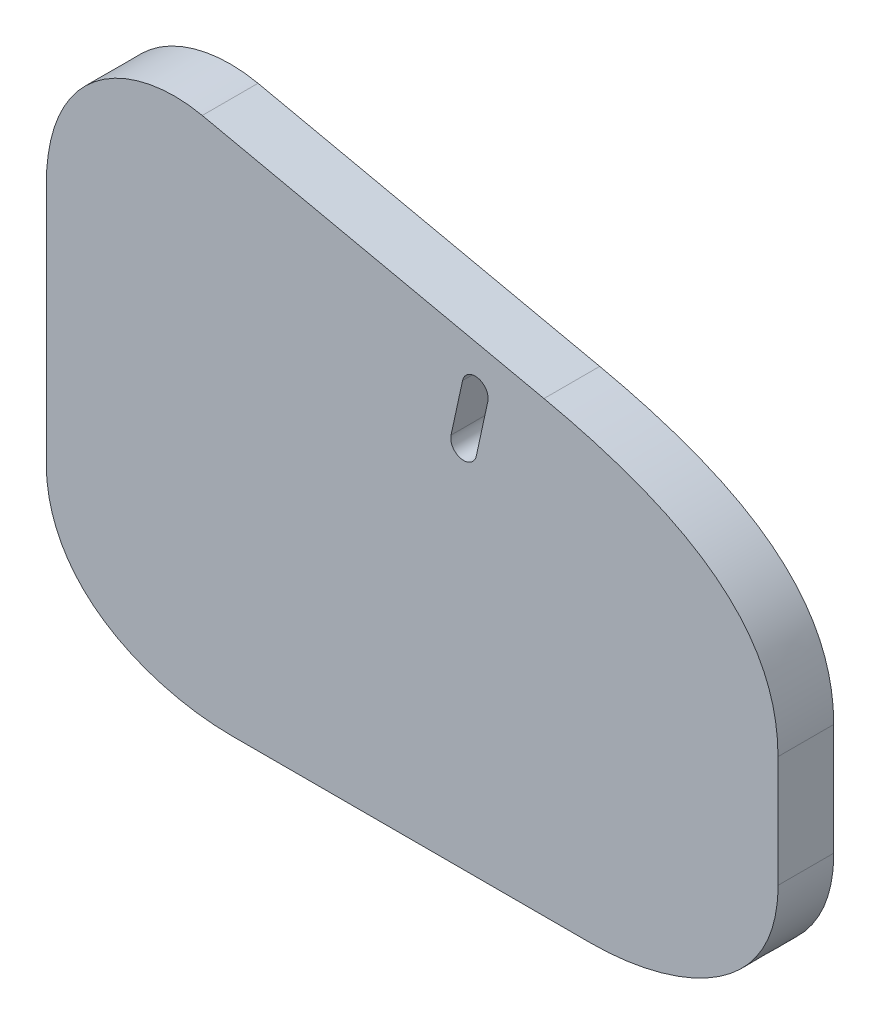
ISO-10303-21;
HEADER;
FILE_DESCRIPTION(('STEP AP214'),'2;1');
FILE_NAME('part.step','',(''),(''),'','','');
FILE_SCHEMA(('AUTOMOTIVE_DESIGN { 1 0 10303 214 1 1 1 1 }'));
ENDSEC;
DATA;
#1=APPLICATION_CONTEXT('core data for automotive mechanical design processes');
#2=APPLICATION_PROTOCOL_DEFINITION('international standard','automotive_design',2000,#1);
#3=PRODUCT_CONTEXT('',#1,'mechanical');
#4=PRODUCT('Part','Part','',(#3));
#5=PRODUCT_RELATED_PRODUCT_CATEGORY('part','',(#4));
#6=PRODUCT_DEFINITION_FORMATION('','',#4);
#7=PRODUCT_DEFINITION_CONTEXT('part definition',#1,'design');
#8=PRODUCT_DEFINITION('design','',#6,#7);
#9=PRODUCT_DEFINITION_SHAPE('','',#8);
#10=(LENGTH_UNIT() NAMED_UNIT(*) SI_UNIT(.MILLI.,.METRE.));
#11=(NAMED_UNIT(*) PLANE_ANGLE_UNIT() SI_UNIT($,.RADIAN.));
#12=(NAMED_UNIT(*) SI_UNIT($,.STERADIAN.) SOLID_ANGLE_UNIT());
#13=UNCERTAINTY_MEASURE_WITH_UNIT(LENGTH_MEASURE(1.E-05),#10,'distance_accuracy_value','');
#14=(GEOMETRIC_REPRESENTATION_CONTEXT(3) GLOBAL_UNCERTAINTY_ASSIGNED_CONTEXT((#13)) GLOBAL_UNIT_ASSIGNED_CONTEXT((#10,
#11,#12)) REPRESENTATION_CONTEXT('',''));
#15=CARTESIAN_POINT('',(0.,0.,0.));
#16=DIRECTION('',(0.,0.,1.));
#17=DIRECTION('',(1.,0.,0.));
#18=AXIS2_PLACEMENT_3D('',#15,#16,#17);
#19=CARTESIAN_POINT('',(-56.3993302443461,40.1399079020647,10.));
#20=DIRECTION('',(0.,0.,-1.));
#21=DIRECTION('',(-1.,0.,0.));
#22=AXIS2_PLACEMENT_3D('',#19,#20,#21);
#23=CYLINDRICAL_SURFACE('',#22,2.31868075153577);
#24=CARTESIAN_POINT('',(-56.3993302443461,40.1399079020647,0.));
#25=DIRECTION('',(0.,0.,1.));
#26=DIRECTION('',(1.,0.,0.));
#27=AXIS2_PLACEMENT_3D('',#24,#25,#26);
#28=CIRCLE('',#27,2.31868075153577);
#29=CARTESIAN_POINT('',(-58.6650902702296,40.6324644294307,0.));
#30=VERTEX_POINT('',#29);
#31=CARTESIAN_POINT('',(-54.1335702184626,39.6473513746988,0.));
#32=VERTEX_POINT('',#31);
#33=EDGE_CURVE('E196',#30,#32,#28,.T.);
#34=ORIENTED_EDGE('',*,*,#33,.F.);
#35=DIRECTION('',(0.,0.,-1.));
#36=VECTOR('',#35,1.);
#37=CARTESIAN_POINT('',(-58.6650902702296,40.6324644294307,10.));
#38=LINE('',#37,#36);
#39=CARTESIAN_POINT('',(-58.6650902702296,40.6324644294307,10.));
#40=VERTEX_POINT('',#39);
#41=EDGE_CURVE('E11',#40,#30,#38,.T.);
#42=ORIENTED_EDGE('',*,*,#41,.F.);
#43=CARTESIAN_POINT('',(-56.3993302443461,40.1399079020647,10.));
#44=DIRECTION('',(0.,0.,1.));
#45=DIRECTION('',(1.,0.,0.));
#46=AXIS2_PLACEMENT_3D('',#43,#44,#45);
#47=CIRCLE('',#46,2.31868075153577);
#48=CARTESIAN_POINT('',(-54.1335702184626,39.6473513746988,10.));
#49=VERTEX_POINT('',#48);
#50=EDGE_CURVE('E149',#40,#49,#47,.T.);
#51=ORIENTED_EDGE('',*,*,#50,.T.);
#52=DIRECTION('',(0.,0.,-1.));
#53=VECTOR('',#52,1.);
#54=CARTESIAN_POINT('',(-54.1335702184626,39.6473513746988,10.));
#55=LINE('',#54,#53);
#56=EDGE_CURVE('E102',#49,#32,#55,.T.);
#57=ORIENTED_EDGE('',*,*,#56,.T.);
#58=EDGE_LOOP('',(#34,#42,#51,#57));
#59=FACE_BOUND('',#58,.T.);
#60=ADVANCED_FACE('F36',(#59),#23,.F.);
#61=CARTESIAN_POINT('',(-64.4522854915812,14.0113664112133,10.));
#62=DIRECTION('',(0.977176363922801,-0.212429644331043,0.));
#63=DIRECTION('',(0.212429644331043,0.977176363922801,0.));
#64=AXIS2_PLACEMENT_3D('',#61,#62,#63);
#65=PLANE('',#64);
#66=DIRECTION('',(-0.212429644331043,-0.977176363922801,0.));
#67=VECTOR('',#66,1.);
#68=CARTESIAN_POINT('',(-64.4522854915812,14.0113664112133,0.));
#69=LINE('',#68,#67);
#70=CARTESIAN_POINT('',(-56.5985730675187,50.138443561901,0.));
#71=VERTEX_POINT('',#70);
#72=EDGE_CURVE('E141',#71,#30,#69,.T.);
#73=ORIENTED_EDGE('',*,*,#72,.F.);
#74=DIRECTION('',(0.,0.,-1.));
#75=VECTOR('',#74,1.);
#76=CARTESIAN_POINT('',(-56.5985730675187,50.138443561901,10.));
#77=LINE('',#76,#75);
#78=CARTESIAN_POINT('',(-56.5985730675187,50.138443561901,10.));
#79=VERTEX_POINT('',#78);
#80=EDGE_CURVE('E47',#79,#71,#77,.T.);
#81=ORIENTED_EDGE('',*,*,#80,.F.);
#82=DIRECTION('',(-0.212429644331043,-0.977176363922801,0.));
#83=VECTOR('',#82,1.);
#84=CARTESIAN_POINT('',(-64.4522854915812,14.0113664112133,10.));
#85=LINE('',#84,#83);
#86=EDGE_CURVE('E139',#79,#40,#85,.T.);
#87=ORIENTED_EDGE('',*,*,#86,.T.);
#88=ORIENTED_EDGE('',*,*,#41,.T.);
#89=EDGE_LOOP('',(#73,#81,#87,#88));
#90=FACE_BOUND('',#89,.T.);
#91=ADVANCED_FACE('F138',(#90),#65,.T.);
#92=CARTESIAN_POINT('',(-54.3328130416352,49.645887034535,10.));
#93=DIRECTION('',(0.,0.,-1.));
#94=DIRECTION('',(-1.,0.,0.));
#95=AXIS2_PLACEMENT_3D('',#92,#93,#94);
#96=CYLINDRICAL_SURFACE('',#95,2.31868075153577);
#97=CARTESIAN_POINT('',(-54.3328130416352,49.645887034535,0.));
#98=DIRECTION('',(0.,0.,1.));
#99=DIRECTION('',(1.,0.,0.));
#100=AXIS2_PLACEMENT_3D('',#97,#98,#99);
#101=CIRCLE('',#100,2.31868075153577);
#102=CARTESIAN_POINT('',(-52.0670530157517,49.153330507169,0.));
#103=VERTEX_POINT('',#102);
#104=EDGE_CURVE('E200',#103,#71,#101,.T.);
#105=ORIENTED_EDGE('',*,*,#104,.F.);
#106=DIRECTION('',(0.,0.,-1.));
#107=VECTOR('',#106,1.);
#108=CARTESIAN_POINT('',(-52.0670530157517,49.153330507169,10.));
#109=LINE('',#108,#107);
#110=CARTESIAN_POINT('',(-52.0670530157517,49.153330507169,10.));
#111=VERTEX_POINT('',#110);
#112=EDGE_CURVE('E95',#111,#103,#109,.T.);
#113=ORIENTED_EDGE('',*,*,#112,.F.);
#114=CARTESIAN_POINT('',(-54.3328130416352,49.645887034535,10.));
#115=DIRECTION('',(0.,0.,1.));
#116=DIRECTION('',(1.,0.,0.));
#117=AXIS2_PLACEMENT_3D('',#114,#115,#116);
#118=CIRCLE('',#117,2.31868075153577);
#119=EDGE_CURVE('E148',#111,#79,#118,.T.);
#120=ORIENTED_EDGE('',*,*,#119,.T.);
#121=ORIENTED_EDGE('',*,*,#80,.T.);
#122=EDGE_LOOP('',(#105,#113,#120,#121));
#123=FACE_BOUND('',#122,.T.);
#124=ADVANCED_FACE('F151',(#123),#96,.F.);
#125=CARTESIAN_POINT('',(-97.9695492341357,-25.7697680525164,10.));
#126=CARTESIAN_POINT('',(-112.011160689261,-25.7697680525164,10.));
#127=CARTESIAN_POINT('',(-131.292525164114,-19.0251558180361,10.));
#128=CARTESIAN_POINT('',(-131.292525164114,0.,10.));
#129=B_SPLINE_CURVE_WITH_KNOTS('',3,(#125,#126,#127,#128),.UNSPECIFIED.,.F.,.F.,(4,4),(0.,1.),.UNSPECIFIED.);
#130=DIRECTION('',(0.,0.,-1.));
#131=VECTOR('',#130,1.);
#132=SURFACE_OF_LINEAR_EXTRUSION('',#129,#131);
#133=CARTESIAN_POINT('',(-97.9695492341357,-25.7697680525164,0.));
#134=CARTESIAN_POINT('',(-112.011160689261,-25.7697680525164,0.));
#135=CARTESIAN_POINT('',(-131.292525164114,-19.0251558180361,0.));
#136=CARTESIAN_POINT('',(-131.292525164114,0.,0.));
#137=B_SPLINE_CURVE_WITH_KNOTS('',3,(#133,#134,#135,#136),.UNSPECIFIED.,.F.,.F.,(4,4),(0.,1.),.UNSPECIFIED.);
#138=CARTESIAN_POINT('',(-97.9695492341357,-25.7697680525164,0.));
#139=VERTEX_POINT('',#138);
#140=CARTESIAN_POINT('',(-131.292525164114,0.,0.));
#141=VERTEX_POINT('',#140);
#142=EDGE_CURVE('E157',#139,#141,#137,.T.);
#143=ORIENTED_EDGE('',*,*,#142,.F.);
#144=DIRECTION('',(0.,0.,-1.));
#145=VECTOR('',#144,1.);
#146=CARTESIAN_POINT('',(-97.9695492341357,-25.7697680525164,10.));
#147=LINE('',#146,#145);
#148=CARTESIAN_POINT('',(-97.9695492341357,-25.7697680525164,10.));
#149=VERTEX_POINT('',#148);
#150=EDGE_CURVE('E41',#149,#139,#147,.T.);
#151=ORIENTED_EDGE('',*,*,#150,.F.);
#152=CARTESIAN_POINT('',(-131.292525164114,0.,10.));
#153=VERTEX_POINT('',#152);
#154=EDGE_CURVE('E204',#149,#153,#129,.T.);
#155=ORIENTED_EDGE('',*,*,#154,.T.);
#156=DIRECTION('',(0.,0.,-1.));
#157=VECTOR('',#156,1.);
#158=CARTESIAN_POINT('',(-131.292525164114,0.,10.));
#159=LINE('',#158,#157);
#160=EDGE_CURVE('E153',#153,#141,#159,.T.);
#161=ORIENTED_EDGE('',*,*,#160,.T.);
#162=EDGE_LOOP('',(#143,#151,#155,#161));
#163=FACE_BOUND('',#162,.T.);
#164=ADVANCED_FACE('F38',(#163),#132,.T.);
#165=CARTESIAN_POINT('',(0.,-25.7697680525164,10.));
#166=DIRECTION('',(0.,-1.,0.));
#167=DIRECTION('',(0.,0.,-1.));
#168=AXIS2_PLACEMENT_3D('',#165,#166,#167);
#169=PLANE('',#168);
#170=DIRECTION('',(-1.,0.,0.));
#171=VECTOR('',#170,1.);
#172=CARTESIAN_POINT('',(0.,-25.7697680525164,0.));
#173=LINE('',#172,#171);
#174=CARTESIAN_POINT('',(-33.5451291028447,-25.7697680525164,0.));
#175=VERTEX_POINT('',#174);
#176=EDGE_CURVE('E162',#175,#139,#173,.T.);
#177=ORIENTED_EDGE('',*,*,#176,.F.);
#178=DIRECTION('',(0.,0.,-1.));
#179=VECTOR('',#178,1.);
#180=CARTESIAN_POINT('',(-33.5451291028447,-25.7697680525164,10.));
#181=LINE('',#180,#179);
#182=CARTESIAN_POINT('',(-33.5451291028447,-25.7697680525164,10.));
#183=VERTEX_POINT('',#182);
#184=EDGE_CURVE('E222',#183,#175,#181,.T.);
#185=ORIENTED_EDGE('',*,*,#184,.F.);
#186=DIRECTION('',(-1.,0.,0.));
#187=VECTOR('',#186,1.);
#188=CARTESIAN_POINT('',(0.,-25.7697680525164,10.));
#189=LINE('',#188,#187);
#190=EDGE_CURVE('E231',#183,#149,#189,.T.);
#191=ORIENTED_EDGE('',*,*,#190,.T.);
#192=ORIENTED_EDGE('',*,*,#150,.T.);
#193=EDGE_LOOP('',(#177,#185,#191,#192));
#194=FACE_BOUND('',#193,.T.);
#195=ADVANCED_FACE('F229',(#194),#169,.T.);
#196=CARTESIAN_POINT('',(-33.5451291028447,-25.7697680525164,10.));
#197=CARTESIAN_POINT('',(-19.4448665678301,-25.7697680525164,10.));
#198=CARTESIAN_POINT('',(0.,-19.0637574545764,10.));
#199=CARTESIAN_POINT('',(0.,0.,10.));
#200=B_SPLINE_CURVE_WITH_KNOTS('',3,(#196,#197,#198,#199),.UNSPECIFIED.,.F.,.F.,(4,4),(0.,1.),.UNSPECIFIED.);
#201=DIRECTION('',(0.,0.,-1.));
#202=VECTOR('',#201,1.);
#203=SURFACE_OF_LINEAR_EXTRUSION('',#200,#202);
#204=CARTESIAN_POINT('',(-33.5451291028447,-25.7697680525164,0.));
#205=CARTESIAN_POINT('',(-19.4448665678301,-25.7697680525164,0.));
#206=CARTESIAN_POINT('',(0.,-19.0637574545764,0.));
#207=CARTESIAN_POINT('',(0.,0.,0.));
#208=B_SPLINE_CURVE_WITH_KNOTS('',3,(#204,#205,#206,#207),.UNSPECIFIED.,.F.,.F.,(4,4),(0.,1.),.UNSPECIFIED.);
#209=CARTESIAN_POINT('',(0.,0.,0.));
#210=VERTEX_POINT('',#209);
#211=EDGE_CURVE('E168',#175,#210,#208,.T.);
#212=ORIENTED_EDGE('',*,*,#211,.T.);
#213=DIRECTION('',(0.,0.,-1.));
#214=VECTOR('',#213,1.);
#215=CARTESIAN_POINT('',(0.,0.,10.));
#216=LINE('',#215,#214);
#217=CARTESIAN_POINT('',(0.,0.,10.));
#218=VERTEX_POINT('',#217);
#219=EDGE_CURVE('E220',#218,#210,#216,.T.);
#220=ORIENTED_EDGE('',*,*,#219,.F.);
#221=EDGE_CURVE('E249',#183,#218,#200,.T.);
#222=ORIENTED_EDGE('',*,*,#221,.F.);
#223=ORIENTED_EDGE('',*,*,#184,.T.);
#224=EDGE_LOOP('',(#212,#220,#222,#223));
#225=FACE_BOUND('',#224,.T.);
#226=ADVANCED_FACE('F240',(#225),#203,.F.);
#227=CARTESIAN_POINT('',(0.,0.,10.));
#228=DIRECTION('',(-1.,0.,0.));
#229=DIRECTION('',(0.,0.,1.));
#230=AXIS2_PLACEMENT_3D('',#227,#228,#229);
#231=PLANE('',#230);
#232=DIRECTION('',(0.,1.,0.));
#233=VECTOR('',#232,1.);
#234=CARTESIAN_POINT('',(0.,0.,0.));
#235=LINE('',#234,#233);
#236=CARTESIAN_POINT('',(0.,20.,0.));
#237=VERTEX_POINT('',#236);
#238=EDGE_CURVE('E172',#210,#237,#235,.T.);
#239=ORIENTED_EDGE('',*,*,#238,.T.);
#240=DIRECTION('',(0.,0.,-1.));
#241=VECTOR('',#240,1.);
#242=CARTESIAN_POINT('',(0.,20.,10.));
#243=LINE('',#242,#241);
#244=CARTESIAN_POINT('',(0.,20.,10.));
#245=VERTEX_POINT('',#244);
#246=EDGE_CURVE('E217',#245,#237,#243,.T.);
#247=ORIENTED_EDGE('',*,*,#246,.F.);
#248=DIRECTION('',(0.,1.,0.));
#249=VECTOR('',#248,1.);
#250=CARTESIAN_POINT('',(0.,0.,10.));
#251=LINE('',#250,#249);
#252=EDGE_CURVE('E245',#218,#245,#251,.T.);
#253=ORIENTED_EDGE('',*,*,#252,.F.);
#254=ORIENTED_EDGE('',*,*,#219,.T.);
#255=EDGE_LOOP('',(#239,#247,#253,#254));
#256=FACE_BOUND('',#255,.T.);
#257=ADVANCED_FACE('F243',(#256),#231,.F.);
#258=CARTESIAN_POINT('',(0.,20.,10.));
#259=CARTESIAN_POINT('',(0.,38.1460258986672,10.));
#260=CARTESIAN_POINT('',(-14.2094741821754,48.6110988969908,10.));
#261=CARTESIAN_POINT('',(-41.9869496717725,54.6496805251641,10.));
#262=B_SPLINE_CURVE_WITH_KNOTS('',3,(#258,#259,#260,#261),.UNSPECIFIED.,.F.,.F.,(4,4),(0.,1.),.UNSPECIFIED.);
#263=DIRECTION('',(0.,0.,-1.));
#264=VECTOR('',#263,1.);
#265=SURFACE_OF_LINEAR_EXTRUSION('',#262,#264);
#266=CARTESIAN_POINT('',(0.,20.,0.));
#267=CARTESIAN_POINT('',(0.,38.1460258986672,0.));
#268=CARTESIAN_POINT('',(-14.2094741821754,48.6110988969908,0.));
#269=CARTESIAN_POINT('',(-41.9869496717725,54.6496805251641,0.));
#270=B_SPLINE_CURVE_WITH_KNOTS('',3,(#266,#267,#268,#269),.UNSPECIFIED.,.F.,.F.,(4,4),(0.,1.),.UNSPECIFIED.);
#271=CARTESIAN_POINT('',(-41.9869496717725,54.6496805251641,0.));
#272=VERTEX_POINT('',#271);
#273=EDGE_CURVE('E177',#237,#272,#270,.T.);
#274=ORIENTED_EDGE('',*,*,#273,.T.);
#275=DIRECTION('',(0.,0.,-1.));
#276=VECTOR('',#275,1.);
#277=CARTESIAN_POINT('',(-41.9869496717725,54.6496805251641,10.));
#278=LINE('',#277,#276);
#279=CARTESIAN_POINT('',(-41.9869496717725,54.6496805251641,10.));
#280=VERTEX_POINT('',#279);
#281=EDGE_CURVE('E214',#280,#272,#278,.T.);
#282=ORIENTED_EDGE('',*,*,#281,.F.);
#283=EDGE_CURVE('E248',#245,#280,#262,.T.);
#284=ORIENTED_EDGE('',*,*,#283,.F.);
#285=ORIENTED_EDGE('',*,*,#246,.T.);
#286=EDGE_LOOP('',(#274,#282,#284,#285));
#287=FACE_BOUND('',#286,.T.);
#288=ADVANCED_FACE('F267',(#287),#265,.F.);
#289=CARTESIAN_POINT('',(9.44952981696672,43.4678371580469,10.));
#290=DIRECTION('',(-0.212429644331044,-0.977176363922801,0.));
#291=DIRECTION('',(0.977176363922801,-0.212429644331044,0.));
#292=AXIS2_PLACEMENT_3D('',#289,#290,#291);
#293=PLANE('',#292);
#294=DIRECTION('',(-0.977176363922801,0.212429644331044,0.));
#295=VECTOR('',#294,1.);
#296=CARTESIAN_POINT('',(9.44952981696672,43.4678371580469,0.));
#297=LINE('',#296,#295);
#298=CARTESIAN_POINT('',(-103.301225382932,67.9788708971554,0.));
#299=VERTEX_POINT('',#298);
#300=EDGE_CURVE('E181',#272,#299,#297,.T.);
#301=ORIENTED_EDGE('',*,*,#300,.T.);
#302=DIRECTION('',(0.,0.,-1.));
#303=VECTOR('',#302,1.);
#304=CARTESIAN_POINT('',(-103.301225382932,67.9788708971554,10.));
#305=LINE('',#304,#303);
#306=CARTESIAN_POINT('',(-103.301225382932,67.9788708971554,10.));
#307=VERTEX_POINT('',#306);
#308=EDGE_CURVE('E211',#307,#299,#305,.T.);
#309=ORIENTED_EDGE('',*,*,#308,.F.);
#310=DIRECTION('',(-0.977176363922801,0.212429644331044,0.));
#311=VECTOR('',#310,1.);
#312=CARTESIAN_POINT('',(9.44952981696672,43.4678371580469,10.));
#313=LINE('',#312,#311);
#314=EDGE_CURVE('E251',#280,#307,#313,.T.);
#315=ORIENTED_EDGE('',*,*,#314,.F.);
#316=ORIENTED_EDGE('',*,*,#281,.T.);
#317=EDGE_LOOP('',(#301,#309,#315,#316));
#318=FACE_BOUND('',#317,.T.);
#319=ADVANCED_FACE('F271',(#318),#293,.F.);
#320=CARTESIAN_POINT('',(-103.301225382932,67.9788708971554,10.));
#321=CARTESIAN_POINT('',(-115.500001367253,70.6307787198339,10.));
#322=CARTESIAN_POINT('',(-131.292525164114,63.3933061839038,10.));
#323=CARTESIAN_POINT('',(-131.292525164114,43.097715536105,10.));
#324=B_SPLINE_CURVE_WITH_KNOTS('',3,(#320,#321,#322,#323),.UNSPECIFIED.,.F.,.F.,(4,4),(0.,1.),.UNSPECIFIED.);
#325=DIRECTION('',(0.,0.,-1.));
#326=VECTOR('',#325,1.);
#327=SURFACE_OF_LINEAR_EXTRUSION('',#324,#326);
#328=CARTESIAN_POINT('',(-103.301225382932,67.9788708971554,0.));
#329=CARTESIAN_POINT('',(-115.500001367253,70.6307787198339,0.));
#330=CARTESIAN_POINT('',(-131.292525164114,63.3933061839038,0.));
#331=CARTESIAN_POINT('',(-131.292525164114,43.097715536105,0.));
#332=B_SPLINE_CURVE_WITH_KNOTS('',3,(#328,#329,#330,#331),.UNSPECIFIED.,.F.,.F.,(4,4),(0.,1.),.UNSPECIFIED.);
#333=CARTESIAN_POINT('',(-131.292525164114,43.097715536105,0.));
#334=VERTEX_POINT('',#333);
#335=EDGE_CURVE('E186',#299,#334,#332,.T.);
#336=ORIENTED_EDGE('',*,*,#335,.T.);
#337=DIRECTION('',(0.,0.,-1.));
#338=VECTOR('',#337,1.);
#339=CARTESIAN_POINT('',(-131.292525164114,43.097715536105,10.));
#340=LINE('',#339,#338);
#341=CARTESIAN_POINT('',(-131.292525164114,43.097715536105,10.));
#342=VERTEX_POINT('',#341);
#343=EDGE_CURVE('E208',#342,#334,#340,.T.);
#344=ORIENTED_EDGE('',*,*,#343,.F.);
#345=EDGE_CURVE('E296',#307,#342,#324,.T.);
#346=ORIENTED_EDGE('',*,*,#345,.F.);
#347=ORIENTED_EDGE('',*,*,#308,.T.);
#348=EDGE_LOOP('',(#336,#344,#346,#347));
#349=FACE_BOUND('',#348,.T.);
#350=ADVANCED_FACE('F292',(#349),#327,.F.);
#351=CARTESIAN_POINT('',(-131.292525164114,0.,10.));
#352=DIRECTION('',(1.,0.,0.));
#353=DIRECTION('',(0.,0.,-1.));
#354=AXIS2_PLACEMENT_3D('',#351,#352,#353);
#355=PLANE('',#354);
#356=DIRECTION('',(0.,-1.,0.));
#357=VECTOR('',#356,1.);
#358=CARTESIAN_POINT('',(-131.292525164114,0.,0.));
#359=LINE('',#358,#357);
#360=EDGE_CURVE('E190',#334,#141,#359,.T.);
#361=ORIENTED_EDGE('',*,*,#360,.T.);
#362=ORIENTED_EDGE('',*,*,#160,.F.);
#363=DIRECTION('',(0.,-1.,0.));
#364=VECTOR('',#363,1.);
#365=CARTESIAN_POINT('',(-131.292525164114,0.,10.));
#366=LINE('',#365,#364);
#367=EDGE_CURVE('E301',#342,#153,#366,.T.);
#368=ORIENTED_EDGE('',*,*,#367,.F.);
#369=ORIENTED_EDGE('',*,*,#343,.T.);
#370=EDGE_LOOP('',(#361,#362,#368,#369));
#371=FACE_BOUND('',#370,.T.);
#372=ADVANCED_FACE('F289',(#371),#355,.F.);
#373=CARTESIAN_POINT('',(-59.9207654398142,13.0262533564813,10.));
#374=DIRECTION('',(0.977176363922801,-0.212429644331043,0.));
#375=DIRECTION('',(0.212429644331043,0.977176363922801,0.));
#376=AXIS2_PLACEMENT_3D('',#373,#374,#375);
#377=PLANE('',#376);
#378=DIRECTION('',(-0.212429644331043,-0.977176363922801,0.));
#379=VECTOR('',#378,1.);
#380=CARTESIAN_POINT('',(-59.9207654398142,13.0262533564813,0.));
#381=LINE('',#380,#379);
#382=EDGE_CURVE('E202',#103,#32,#381,.T.);
#383=ORIENTED_EDGE('',*,*,#382,.T.);
#384=ORIENTED_EDGE('',*,*,#56,.F.);
#385=DIRECTION('',(-0.212429644331043,-0.977176363922801,0.));
#386=VECTOR('',#385,1.);
#387=CARTESIAN_POINT('',(-59.9207654398142,13.0262533564813,10.));
#388=LINE('',#387,#386);
#389=EDGE_CURVE('E56',#111,#49,#388,.T.);
#390=ORIENTED_EDGE('',*,*,#389,.F.);
#391=ORIENTED_EDGE('',*,*,#112,.T.);
#392=EDGE_LOOP('',(#383,#384,#390,#391));
#393=FACE_BOUND('',#392,.T.);
#394=ADVANCED_FACE('F291',(#393),#377,.F.);
#395=CARTESIAN_POINT('',(0.,0.,10.));
#396=DIRECTION('',(0.,0.,1.));
#397=DIRECTION('',(1.,0.,0.));
#398=AXIS2_PLACEMENT_3D('',#395,#396,#397);
#399=PLANE('',#398);
#400=ORIENTED_EDGE('',*,*,#154,.F.);
#401=ORIENTED_EDGE('',*,*,#190,.F.);
#402=ORIENTED_EDGE('',*,*,#221,.T.);
#403=ORIENTED_EDGE('',*,*,#252,.T.);
#404=ORIENTED_EDGE('',*,*,#283,.T.);
#405=ORIENTED_EDGE('',*,*,#314,.T.);
#406=ORIENTED_EDGE('',*,*,#345,.T.);
#407=ORIENTED_EDGE('',*,*,#367,.T.);
#408=EDGE_LOOP('',(#400,#401,#402,#403,#404,#405,#406,#407));
#409=FACE_BOUND('',#408,.T.);
#410=ORIENTED_EDGE('',*,*,#50,.F.);
#411=ORIENTED_EDGE('',*,*,#86,.F.);
#412=ORIENTED_EDGE('',*,*,#119,.F.);
#413=ORIENTED_EDGE('',*,*,#389,.T.);
#414=EDGE_LOOP('',(#410,#411,#412,#413));
#415=FACE_BOUND('',#414,.T.);
#416=ADVANCED_FACE('F147',(#409,#415),#399,.T.);
#417=CARTESIAN_POINT('',(0.,0.,0.));
#418=DIRECTION('',(0.,0.,1.));
#419=DIRECTION('',(1.,0.,0.));
#420=AXIS2_PLACEMENT_3D('',#417,#418,#419);
#421=PLANE('',#420);
#422=ORIENTED_EDGE('',*,*,#142,.T.);
#423=ORIENTED_EDGE('',*,*,#360,.F.);
#424=ORIENTED_EDGE('',*,*,#335,.F.);
#425=ORIENTED_EDGE('',*,*,#300,.F.);
#426=ORIENTED_EDGE('',*,*,#273,.F.);
#427=ORIENTED_EDGE('',*,*,#238,.F.);
#428=ORIENTED_EDGE('',*,*,#211,.F.);
#429=ORIENTED_EDGE('',*,*,#176,.T.);
#430=EDGE_LOOP('',(#422,#423,#424,#425,#426,#427,#428,#429));
#431=FACE_BOUND('',#430,.T.);
#432=ORIENTED_EDGE('',*,*,#33,.T.);
#433=ORIENTED_EDGE('',*,*,#382,.F.);
#434=ORIENTED_EDGE('',*,*,#104,.T.);
#435=ORIENTED_EDGE('',*,*,#72,.T.);
#436=EDGE_LOOP('',(#432,#433,#434,#435));
#437=FACE_BOUND('',#436,.T.);
#438=ADVANCED_FACE('F235',(#431,#437),#421,.F.);
#439=CLOSED_SHELL('',(#60,#91,#124,#164,#195,#226,#257,#288,#319,#350,#372,#394,#416,#438));
#440=MANIFOLD_SOLID_BREP('B2',#439);
#441=ADVANCED_BREP_SHAPE_REPRESENTATION('',(#18,#440),#14);
#442=SHAPE_DEFINITION_REPRESENTATION(#9,#441);
ENDSEC;
END-ISO-10303-21;
